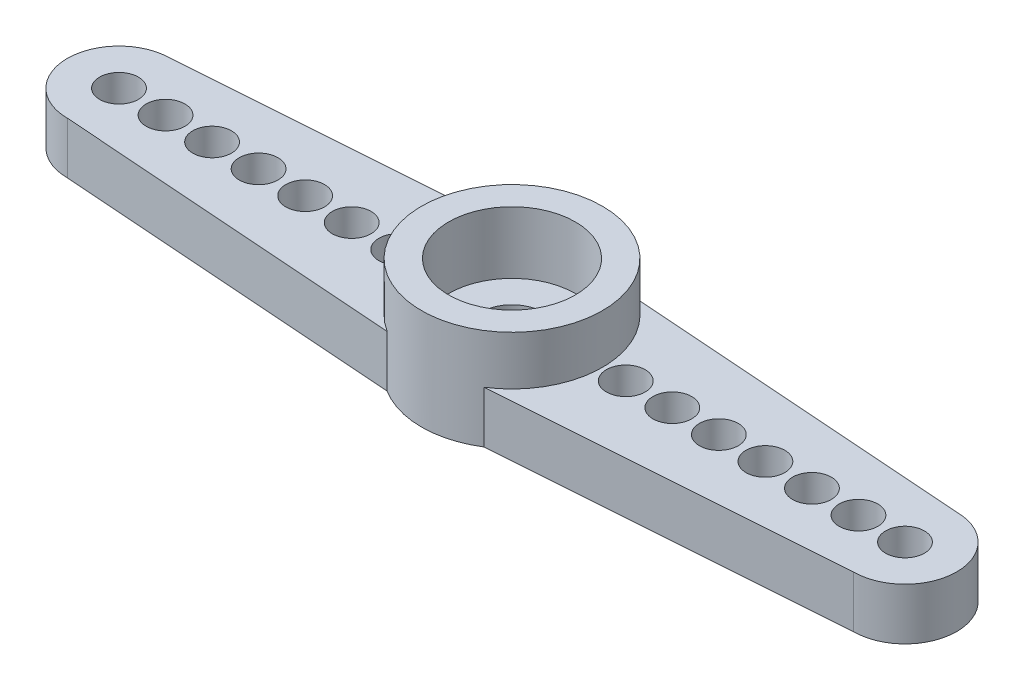
ISO-10303-21;
HEADER;
FILE_DESCRIPTION(('STEP AP214'),'2;1');
FILE_NAME('part.step','',(''),(''),'','','');
FILE_SCHEMA(('AUTOMOTIVE_DESIGN { 1 0 10303 214 1 1 1 1 }'));
ENDSEC;
DATA;
#1=APPLICATION_CONTEXT('core data for automotive mechanical design processes');
#2=APPLICATION_PROTOCOL_DEFINITION('international standard','automotive_design',2000,#1);
#3=PRODUCT_CONTEXT('',#1,'mechanical');
#4=PRODUCT('Part','Part','',(#3));
#5=PRODUCT_RELATED_PRODUCT_CATEGORY('part','',(#4));
#6=PRODUCT_DEFINITION_FORMATION('','',#4);
#7=PRODUCT_DEFINITION_CONTEXT('part definition',#1,'design');
#8=PRODUCT_DEFINITION('design','',#6,#7);
#9=PRODUCT_DEFINITION_SHAPE('','',#8);
#10=(LENGTH_UNIT() NAMED_UNIT(*) SI_UNIT(.MILLI.,.METRE.));
#11=(NAMED_UNIT(*) PLANE_ANGLE_UNIT() SI_UNIT($,.RADIAN.));
#12=(NAMED_UNIT(*) SI_UNIT($,.STERADIAN.) SOLID_ANGLE_UNIT());
#13=UNCERTAINTY_MEASURE_WITH_UNIT(LENGTH_MEASURE(1.E-05),#10,'distance_accuracy_value','');
#14=(GEOMETRIC_REPRESENTATION_CONTEXT(3) GLOBAL_UNCERTAINTY_ASSIGNED_CONTEXT((#13)) GLOBAL_UNIT_ASSIGNED_CONTEXT((#10,
#11,#12)) REPRESENTATION_CONTEXT('',''));
#15=CARTESIAN_POINT('',(0.,0.,0.));
#16=DIRECTION('',(0.,0.,1.));
#17=DIRECTION('',(1.,0.,0.));
#18=AXIS2_PLACEMENT_3D('',#15,#16,#17);
#19=CARTESIAN_POINT('',(0.,3.9,0.));
#20=DIRECTION('',(0.,-1.,0.));
#21=DIRECTION('',(0.,0.,-1.));
#22=AXIS2_PLACEMENT_3D('',#19,#20,#21);
#23=CYLINDRICAL_SURFACE('',#22,3.5);
#24=DIRECTION('',(0.,-1.,0.));
#25=VECTOR('',#24,1.);
#26=CARTESIAN_POINT('',(1.86858471289894,2.,2.95945791838985));
#27=LINE('',#26,#25);
#28=CARTESIAN_POINT('',(1.86858471289894,2.,2.95945791838985));
#29=VERTEX_POINT('',#28);
#30=CARTESIAN_POINT('',(1.86858471289894,0.,2.95945791838985));
#31=VERTEX_POINT('',#30);
#32=EDGE_CURVE('E125',#29,#31,#27,.T.);
#33=ORIENTED_EDGE('',*,*,#32,.F.);
#34=CARTESIAN_POINT('',(0.,2.,0.));
#35=DIRECTION('',(0.,1.,0.));
#36=DIRECTION('',(0.,0.,1.));
#37=AXIS2_PLACEMENT_3D('',#34,#35,#36);
#38=CIRCLE('',#37,3.5);
#39=CARTESIAN_POINT('',(1.86858471289895,2.,-2.95945791838985));
#40=VERTEX_POINT('',#39);
#41=EDGE_CURVE('E117',#29,#40,#38,.T.);
#42=ORIENTED_EDGE('',*,*,#41,.T.);
#43=DIRECTION('',(0.,-1.,0.));
#44=VECTOR('',#43,1.);
#45=CARTESIAN_POINT('',(1.86858471289895,2.,-2.95945791838985));
#46=LINE('',#45,#44);
#47=CARTESIAN_POINT('',(1.86858471289895,0.,-2.95945791838985));
#48=VERTEX_POINT('',#47);
#49=EDGE_CURVE('E101',#40,#48,#46,.T.);
#50=ORIENTED_EDGE('',*,*,#49,.T.);
#51=CARTESIAN_POINT('',(0.,0.,0.));
#52=DIRECTION('',(0.,-1.,0.));
#53=DIRECTION('',(0.,0.,-1.));
#54=AXIS2_PLACEMENT_3D('',#51,#52,#53);
#55=CIRCLE('',#54,3.5);
#56=CARTESIAN_POINT('',(-1.86858471289894,0.,-2.95945791838985));
#57=VERTEX_POINT('',#56);
#58=EDGE_CURVE('E41',#57,#48,#55,.T.);
#59=ORIENTED_EDGE('',*,*,#58,.F.);
#60=DIRECTION('',(0.,-1.,0.));
#61=VECTOR('',#60,1.);
#62=CARTESIAN_POINT('',(-1.86858471289895,2.,-2.95945791838985));
#63=LINE('',#62,#61);
#64=CARTESIAN_POINT('',(-1.86858471289895,2.,-2.95945791838985));
#65=VERTEX_POINT('',#64);
#66=EDGE_CURVE('E160',#65,#57,#63,.T.);
#67=ORIENTED_EDGE('',*,*,#66,.F.);
#68=CARTESIAN_POINT('',(0.,2.,0.));
#69=DIRECTION('',(0.,1.,0.));
#70=DIRECTION('',(0.,0.,1.));
#71=AXIS2_PLACEMENT_3D('',#68,#69,#70);
#72=CIRCLE('',#71,3.5);
#73=CARTESIAN_POINT('',(-1.86858471289894,2.,2.95945791838985));
#74=VERTEX_POINT('',#73);
#75=EDGE_CURVE('E142',#65,#74,#72,.T.);
#76=ORIENTED_EDGE('',*,*,#75,.T.);
#77=DIRECTION('',(0.,-1.,0.));
#78=VECTOR('',#77,1.);
#79=CARTESIAN_POINT('',(-1.86858471289894,2.,2.95945791838985));
#80=LINE('',#79,#78);
#81=CARTESIAN_POINT('',(-1.86858471289894,0.,2.95945791838985));
#82=VERTEX_POINT('',#81);
#83=EDGE_CURVE('E154',#74,#82,#80,.T.);
#84=ORIENTED_EDGE('',*,*,#83,.T.);
#85=EDGE_CURVE('E162',#31,#82,#55,.T.);
#86=ORIENTED_EDGE('',*,*,#85,.F.);
#87=EDGE_LOOP('',(#33,#42,#50,#59,#67,#76,#84,#86));
#88=FACE_BOUND('',#87,.T.);
#89=CARTESIAN_POINT('',(0.,3.9,0.));
#90=DIRECTION('',(0.,-1.,0.));
#91=DIRECTION('',(0.,0.,-1.));
#92=AXIS2_PLACEMENT_3D('',#89,#90,#91);
#93=CIRCLE('',#92,3.5);
#94=CARTESIAN_POINT('',(0.,3.9,-3.5));
#95=VERTEX_POINT('',#94);
#96=EDGE_CURVE('E11',#95,#95,#93,.T.);
#97=ORIENTED_EDGE('',*,*,#96,.T.);
#98=EDGE_LOOP('',(#97));
#99=FACE_BOUND('',#98,.T.);
#100=ADVANCED_FACE('F33',(#88,#99),#23,.T.);
#101=CARTESIAN_POINT('',(3.5,3.9,0.));
#102=DIRECTION('',(0.,1.,0.));
#103=DIRECTION('',(0.,0.,1.));
#104=AXIS2_PLACEMENT_3D('',#101,#102,#103);
#105=PLANE('',#104);
#106=CARTESIAN_POINT('',(0.,3.9,0.));
#107=DIRECTION('',(0.,-1.,0.));
#108=DIRECTION('',(0.,0.,-1.));
#109=AXIS2_PLACEMENT_3D('',#106,#107,#108);
#110=CIRCLE('',#109,2.45);
#111=CARTESIAN_POINT('',(0.,3.9,-2.45));
#112=VERTEX_POINT('',#111);
#113=EDGE_CURVE('E130',#112,#112,#110,.T.);
#114=ORIENTED_EDGE('',*,*,#113,.T.);
#115=EDGE_LOOP('',(#114));
#116=FACE_BOUND('',#115,.T.);
#117=ORIENTED_EDGE('',*,*,#96,.F.);
#118=EDGE_LOOP('',(#117));
#119=FACE_BOUND('',#118,.T.);
#120=ADVANCED_FACE('F250',(#116,#119),#105,.T.);
#121=CARTESIAN_POINT('',(0.,0.,0.));
#122=DIRECTION('',(0.,-1.,0.));
#123=DIRECTION('',(0.,0.,-1.));
#124=AXIS2_PLACEMENT_3D('',#121,#122,#123);
#125=PLANE('',#124);
#126=CARTESIAN_POINT('',(-15.2,0.,0.));
#127=DIRECTION('',(0.,-1.,0.));
#128=DIRECTION('',(0.,0.,-1.));
#129=AXIS2_PLACEMENT_3D('',#126,#127,#128);
#130=CIRCLE('',#129,0.749999999999999);
#131=CARTESIAN_POINT('',(-15.2,0.,-0.749999999999999));
#132=VERTEX_POINT('',#131);
#133=EDGE_CURVE('E414',#132,#132,#130,.T.);
#134=ORIENTED_EDGE('',*,*,#133,.F.);
#135=EDGE_LOOP('',(#134));
#136=FACE_BOUND('',#135,.T.);
#137=CARTESIAN_POINT('',(15.2,0.,0.));
#138=DIRECTION('',(0.,-1.,0.));
#139=DIRECTION('',(0.,0.,-1.));
#140=AXIS2_PLACEMENT_3D('',#137,#138,#139);
#141=CIRCLE('',#140,0.749999999999999);
#142=CARTESIAN_POINT('',(15.2,0.,-0.750000000000006));
#143=VERTEX_POINT('',#142);
#144=EDGE_CURVE('E416',#143,#143,#141,.T.);
#145=ORIENTED_EDGE('',*,*,#144,.F.);
#146=EDGE_LOOP('',(#145));
#147=FACE_BOUND('',#146,.T.);
#148=CARTESIAN_POINT('',(-13.4,0.,0.));
#149=DIRECTION('',(0.,-1.,0.));
#150=DIRECTION('',(0.,0.,-1.));
#151=AXIS2_PLACEMENT_3D('',#148,#149,#150);
#152=CIRCLE('',#151,0.749999999999999);
#153=CARTESIAN_POINT('',(-13.4,0.,-0.749999999999999));
#154=VERTEX_POINT('',#153);
#155=EDGE_CURVE('E421',#154,#154,#152,.T.);
#156=ORIENTED_EDGE('',*,*,#155,.F.);
#157=EDGE_LOOP('',(#156));
#158=FACE_BOUND('',#157,.T.);
#159=CARTESIAN_POINT('',(-11.6,0.,0.));
#160=DIRECTION('',(0.,-1.,0.));
#161=DIRECTION('',(0.,0.,-1.));
#162=AXIS2_PLACEMENT_3D('',#159,#160,#161);
#163=CIRCLE('',#162,0.749999999999999);
#164=CARTESIAN_POINT('',(-11.6,0.,-0.749999999999999));
#165=VERTEX_POINT('',#164);
#166=EDGE_CURVE('E427',#165,#165,#163,.T.);
#167=ORIENTED_EDGE('',*,*,#166,.F.);
#168=EDGE_LOOP('',(#167));
#169=FACE_BOUND('',#168,.T.);
#170=CARTESIAN_POINT('',(-9.8,0.,0.));
#171=DIRECTION('',(0.,-1.,0.));
#172=DIRECTION('',(0.,0.,-1.));
#173=AXIS2_PLACEMENT_3D('',#170,#171,#172);
#174=CIRCLE('',#173,0.749999999999999);
#175=CARTESIAN_POINT('',(-9.8,0.,-0.749999999999999));
#176=VERTEX_POINT('',#175);
#177=EDGE_CURVE('E197',#176,#176,#174,.T.);
#178=ORIENTED_EDGE('',*,*,#177,.F.);
#179=EDGE_LOOP('',(#178));
#180=FACE_BOUND('',#179,.T.);
#181=CARTESIAN_POINT('',(-8.,0.,0.));
#182=DIRECTION('',(0.,-1.,0.));
#183=DIRECTION('',(0.,0.,-1.));
#184=AXIS2_PLACEMENT_3D('',#181,#182,#183);
#185=CIRCLE('',#184,0.75);
#186=CARTESIAN_POINT('',(-8.,0.,-0.75));
#187=VERTEX_POINT('',#186);
#188=EDGE_CURVE('E185',#187,#187,#185,.T.);
#189=ORIENTED_EDGE('',*,*,#188,.F.);
#190=EDGE_LOOP('',(#189));
#191=FACE_BOUND('',#190,.T.);
#192=CARTESIAN_POINT('',(-6.2,0.,0.));
#193=DIRECTION('',(0.,-1.,0.));
#194=DIRECTION('',(0.,0.,-1.));
#195=AXIS2_PLACEMENT_3D('',#192,#193,#194);
#196=CIRCLE('',#195,0.75);
#197=CARTESIAN_POINT('',(-6.2,0.,-0.75));
#198=VERTEX_POINT('',#197);
#199=EDGE_CURVE('E184',#198,#198,#196,.T.);
#200=ORIENTED_EDGE('',*,*,#199,.F.);
#201=EDGE_LOOP('',(#200));
#202=FACE_BOUND('',#201,.T.);
#203=CARTESIAN_POINT('',(-4.4,0.,0.));
#204=DIRECTION('',(0.,-1.,0.));
#205=DIRECTION('',(0.,0.,-1.));
#206=AXIS2_PLACEMENT_3D('',#203,#204,#205);
#207=CIRCLE('',#206,0.75);
#208=CARTESIAN_POINT('',(-4.4,0.,-0.75));
#209=VERTEX_POINT('',#208);
#210=EDGE_CURVE('E181',#209,#209,#207,.T.);
#211=ORIENTED_EDGE('',*,*,#210,.F.);
#212=EDGE_LOOP('',(#211));
#213=FACE_BOUND('',#212,.T.);
#214=CARTESIAN_POINT('',(13.4,0.,0.));
#215=DIRECTION('',(0.,-1.,0.));
#216=DIRECTION('',(0.,0.,-1.));
#217=AXIS2_PLACEMENT_3D('',#214,#215,#216);
#218=CIRCLE('',#217,0.749999999999999);
#219=CARTESIAN_POINT('',(13.4,0.,-0.749999999999993));
#220=VERTEX_POINT('',#219);
#221=EDGE_CURVE('E178',#220,#220,#218,.T.);
#222=ORIENTED_EDGE('',*,*,#221,.F.);
#223=EDGE_LOOP('',(#222));
#224=FACE_BOUND('',#223,.T.);
#225=CARTESIAN_POINT('',(11.6,0.,0.));
#226=DIRECTION('',(0.,-1.,0.));
#227=DIRECTION('',(0.,0.,-1.));
#228=AXIS2_PLACEMENT_3D('',#225,#226,#227);
#229=CIRCLE('',#228,0.749999999999999);
#230=CARTESIAN_POINT('',(11.6,0.,-0.749999999999981));
#231=VERTEX_POINT('',#230);
#232=EDGE_CURVE('E174',#231,#231,#229,.T.);
#233=ORIENTED_EDGE('',*,*,#232,.F.);
#234=EDGE_LOOP('',(#233));
#235=FACE_BOUND('',#234,.T.);
#236=CARTESIAN_POINT('',(9.8,0.,0.));
#237=DIRECTION('',(0.,-1.,0.));
#238=DIRECTION('',(0.,0.,-1.));
#239=AXIS2_PLACEMENT_3D('',#236,#237,#238);
#240=CIRCLE('',#239,0.749999999999999);
#241=CARTESIAN_POINT('',(9.8,0.,-0.749999999999968));
#242=VERTEX_POINT('',#241);
#243=EDGE_CURVE('E173',#242,#242,#240,.T.);
#244=ORIENTED_EDGE('',*,*,#243,.F.);
#245=EDGE_LOOP('',(#244));
#246=FACE_BOUND('',#245,.T.);
#247=CARTESIAN_POINT('',(8.,0.,0.));
#248=DIRECTION('',(0.,-1.,0.));
#249=DIRECTION('',(0.,0.,-1.));
#250=AXIS2_PLACEMENT_3D('',#247,#248,#249);
#251=CIRCLE('',#250,0.749999999999999);
#252=CARTESIAN_POINT('',(8.,0.,-0.749999999999956));
#253=VERTEX_POINT('',#252);
#254=EDGE_CURVE('E214',#253,#253,#251,.T.);
#255=ORIENTED_EDGE('',*,*,#254,.F.);
#256=EDGE_LOOP('',(#255));
#257=FACE_BOUND('',#256,.T.);
#258=CARTESIAN_POINT('',(6.2,0.,0.));
#259=DIRECTION('',(0.,-1.,0.));
#260=DIRECTION('',(0.,0.,-1.));
#261=AXIS2_PLACEMENT_3D('',#258,#259,#260);
#262=CIRCLE('',#261,0.75);
#263=CARTESIAN_POINT('',(6.2,0.,-0.749999999999944));
#264=VERTEX_POINT('',#263);
#265=EDGE_CURVE('E220',#264,#264,#262,.T.);
#266=ORIENTED_EDGE('',*,*,#265,.F.);
#267=EDGE_LOOP('',(#266));
#268=FACE_BOUND('',#267,.T.);
#269=CARTESIAN_POINT('',(4.4,0.,0.));
#270=DIRECTION('',(0.,-1.,0.));
#271=DIRECTION('',(0.,0.,-1.));
#272=AXIS2_PLACEMENT_3D('',#269,#270,#271);
#273=CIRCLE('',#272,0.75);
#274=CARTESIAN_POINT('',(4.4,0.,-0.749999999999931));
#275=VERTEX_POINT('',#274);
#276=EDGE_CURVE('E226',#275,#275,#273,.T.);
#277=ORIENTED_EDGE('',*,*,#276,.F.);
#278=EDGE_LOOP('',(#277));
#279=FACE_BOUND('',#278,.T.);
#280=CARTESIAN_POINT('',(0.,0.,0.));
#281=DIRECTION('',(0.,-1.,0.));
#282=DIRECTION('',(0.,0.,-1.));
#283=AXIS2_PLACEMENT_3D('',#280,#281,#282);
#284=CIRCLE('',#283,2.35);
#285=CARTESIAN_POINT('',(0.,0.,-2.35));
#286=VERTEX_POINT('',#285);
#287=EDGE_CURVE('E243',#286,#286,#284,.T.);
#288=ORIENTED_EDGE('',*,*,#287,.F.);
#289=EDGE_LOOP('',(#288));
#290=FACE_BOUND('',#289,.T.);
#291=ORIENTED_EDGE('',*,*,#58,.T.);
#292=DIRECTION('',(0.997420198870011,0.,0.0717840294641297));
#293=VECTOR('',#292,1.);
#294=CARTESIAN_POINT('',(1.86858471289895,0.,-2.95945791838985));
#295=LINE('',#294,#293);
#296=CARTESIAN_POINT('',(15.2,0.,-2.00000000000001));
#297=VERTEX_POINT('',#296);
#298=EDGE_CURVE('E106',#48,#297,#295,.T.);
#299=ORIENTED_EDGE('',*,*,#298,.T.);
#300=CARTESIAN_POINT('',(15.2,0.,0.));
#301=DIRECTION('',(0.,-1.,0.));
#302=DIRECTION('',(0.,0.,-1.));
#303=AXIS2_PLACEMENT_3D('',#300,#301,#302);
#304=CIRCLE('',#303,2.);
#305=CARTESIAN_POINT('',(15.2,0.,2.));
#306=VERTEX_POINT('',#305);
#307=EDGE_CURVE('E127',#297,#306,#304,.T.);
#308=ORIENTED_EDGE('',*,*,#307,.T.);
#309=DIRECTION('',(-0.997420198870011,0.,0.0717840294641297));
#310=VECTOR('',#309,1.);
#311=CARTESIAN_POINT('',(15.2,0.,2.));
#312=LINE('',#311,#310);
#313=EDGE_CURVE('E49',#306,#31,#312,.T.);
#314=ORIENTED_EDGE('',*,*,#313,.T.);
#315=ORIENTED_EDGE('',*,*,#85,.T.);
#316=DIRECTION('',(-0.997420198870011,0.,-0.0717840294641297));
#317=VECTOR('',#316,1.);
#318=CARTESIAN_POINT('',(-1.86858471289894,0.,2.95945791838985));
#319=LINE('',#318,#317);
#320=CARTESIAN_POINT('',(-15.2,0.,2.));
#321=VERTEX_POINT('',#320);
#322=EDGE_CURVE('E138',#82,#321,#319,.T.);
#323=ORIENTED_EDGE('',*,*,#322,.T.);
#324=CARTESIAN_POINT('',(-15.2,0.,0.));
#325=DIRECTION('',(0.,-1.,0.));
#326=DIRECTION('',(0.,0.,-1.));
#327=AXIS2_PLACEMENT_3D('',#324,#325,#326);
#328=CIRCLE('',#327,2.);
#329=CARTESIAN_POINT('',(-15.2,0.,-2.));
#330=VERTEX_POINT('',#329);
#331=EDGE_CURVE('E157',#321,#330,#328,.T.);
#332=ORIENTED_EDGE('',*,*,#331,.T.);
#333=DIRECTION('',(0.997420198870011,0.,-0.0717840294641297));
#334=VECTOR('',#333,1.);
#335=CARTESIAN_POINT('',(-15.2,0.,-2.));
#336=LINE('',#335,#334);
#337=EDGE_CURVE('E56',#330,#57,#336,.T.);
#338=ORIENTED_EDGE('',*,*,#337,.T.);
#339=EDGE_LOOP('',(#291,#299,#308,#314,#315,#323,#332,#338));
#340=FACE_BOUND('',#339,.T.);
#341=ADVANCED_FACE('F287',(#136,#147,#158,#169,#180,#191,#202,#213,#224,#235,#246,#257,#268,
#279,#290,#340),#125,.T.);
#342=CARTESIAN_POINT('',(-15.2,2.,-2.));
#343=DIRECTION('',(-0.0717840294641297,0.,-0.997420198870011));
#344=DIRECTION('',(-0.997420198870011,0.,0.0717840294641297));
#345=AXIS2_PLACEMENT_3D('',#342,#343,#344);
#346=PLANE('',#345);
#347=ORIENTED_EDGE('',*,*,#337,.F.);
#348=DIRECTION('',(0.,-1.,0.));
#349=VECTOR('',#348,1.);
#350=CARTESIAN_POINT('',(-15.2,2.,-2.));
#351=LINE('',#350,#349);
#352=CARTESIAN_POINT('',(-15.2,2.,-2.));
#353=VERTEX_POINT('',#352);
#354=EDGE_CURVE('E163',#353,#330,#351,.T.);
#355=ORIENTED_EDGE('',*,*,#354,.F.);
#356=DIRECTION('',(0.997420198870011,0.,-0.0717840294641297));
#357=VECTOR('',#356,1.);
#358=CARTESIAN_POINT('',(-15.2,2.,-2.));
#359=LINE('',#358,#357);
#360=EDGE_CURVE('E151',#353,#65,#359,.T.);
#361=ORIENTED_EDGE('',*,*,#360,.T.);
#362=ORIENTED_EDGE('',*,*,#66,.T.);
#363=EDGE_LOOP('',(#347,#355,#361,#362));
#364=FACE_BOUND('',#363,.T.);
#365=ADVANCED_FACE('F291',(#364),#346,.T.);
#366=CARTESIAN_POINT('',(-15.2,2.,0.));
#367=DIRECTION('',(0.,-1.,0.));
#368=DIRECTION('',(0.,0.,-1.));
#369=AXIS2_PLACEMENT_3D('',#366,#367,#368);
#370=CYLINDRICAL_SURFACE('',#369,2.);
#371=ORIENTED_EDGE('',*,*,#331,.F.);
#372=DIRECTION('',(0.,-1.,0.));
#373=VECTOR('',#372,1.);
#374=CARTESIAN_POINT('',(-15.2,2.,2.));
#375=LINE('',#374,#373);
#376=CARTESIAN_POINT('',(-15.2,2.,2.));
#377=VERTEX_POINT('',#376);
#378=EDGE_CURVE('E165',#377,#321,#375,.T.);
#379=ORIENTED_EDGE('',*,*,#378,.F.);
#380=CARTESIAN_POINT('',(-15.2,2.,0.));
#381=DIRECTION('',(0.,-1.,0.));
#382=DIRECTION('',(0.,0.,-1.));
#383=AXIS2_PLACEMENT_3D('',#380,#381,#382);
#384=CIRCLE('',#383,2.);
#385=EDGE_CURVE('E148',#377,#353,#384,.T.);
#386=ORIENTED_EDGE('',*,*,#385,.T.);
#387=ORIENTED_EDGE('',*,*,#354,.T.);
#388=EDGE_LOOP('',(#371,#379,#386,#387));
#389=FACE_BOUND('',#388,.T.);
#390=ADVANCED_FACE('F299',(#389),#370,.T.);
#391=CARTESIAN_POINT('',(-1.86858471289894,2.,2.95945791838985));
#392=DIRECTION('',(-0.0717840294641297,0.,0.997420198870011));
#393=DIRECTION('',(0.997420198870011,0.,0.0717840294641297));
#394=AXIS2_PLACEMENT_3D('',#391,#392,#393);
#395=PLANE('',#394);
#396=ORIENTED_EDGE('',*,*,#322,.F.);
#397=ORIENTED_EDGE('',*,*,#83,.F.);
#398=DIRECTION('',(-0.997420198870011,0.,-0.0717840294641297));
#399=VECTOR('',#398,1.);
#400=CARTESIAN_POINT('',(-1.86858471289894,2.,2.95945791838985));
#401=LINE('',#400,#399);
#402=EDGE_CURVE('E145',#74,#377,#401,.T.);
#403=ORIENTED_EDGE('',*,*,#402,.T.);
#404=ORIENTED_EDGE('',*,*,#378,.T.);
#405=EDGE_LOOP('',(#396,#397,#403,#404));
#406=FACE_BOUND('',#405,.T.);
#407=ADVANCED_FACE('F295',(#406),#395,.T.);
#408=CARTESIAN_POINT('',(0.,2.,0.));
#409=DIRECTION('',(0.,1.,0.));
#410=DIRECTION('',(0.,0.,1.));
#411=AXIS2_PLACEMENT_3D('',#408,#409,#410);
#412=PLANE('',#411);
#413=CARTESIAN_POINT('',(-15.2,2.,0.));
#414=DIRECTION('',(0.,1.,0.));
#415=DIRECTION('',(0.,0.,1.));
#416=AXIS2_PLACEMENT_3D('',#413,#414,#415);
#417=CIRCLE('',#416,0.749999999999999);
#418=CARTESIAN_POINT('',(-15.2,2.,0.749999999999999));
#419=VERTEX_POINT('',#418);
#420=EDGE_CURVE('E36',#419,#419,#417,.T.);
#421=ORIENTED_EDGE('',*,*,#420,.F.);
#422=EDGE_LOOP('',(#421));
#423=FACE_BOUND('',#422,.T.);
#424=CARTESIAN_POINT('',(-13.4,2.,0.));
#425=DIRECTION('',(0.,1.,0.));
#426=DIRECTION('',(0.,0.,1.));
#427=AXIS2_PLACEMENT_3D('',#424,#425,#426);
#428=CIRCLE('',#427,0.749999999999999);
#429=CARTESIAN_POINT('',(-13.4,2.,0.749999999999999));
#430=VERTEX_POINT('',#429);
#431=EDGE_CURVE('E424',#430,#430,#428,.T.);
#432=ORIENTED_EDGE('',*,*,#431,.F.);
#433=EDGE_LOOP('',(#432));
#434=FACE_BOUND('',#433,.T.);
#435=CARTESIAN_POINT('',(-11.6,2.,0.));
#436=DIRECTION('',(0.,1.,0.));
#437=DIRECTION('',(0.,0.,1.));
#438=AXIS2_PLACEMENT_3D('',#435,#436,#437);
#439=CIRCLE('',#438,0.749999999999999);
#440=CARTESIAN_POINT('',(-11.6,2.,0.749999999999999));
#441=VERTEX_POINT('',#440);
#442=EDGE_CURVE('E430',#441,#441,#439,.T.);
#443=ORIENTED_EDGE('',*,*,#442,.F.);
#444=EDGE_LOOP('',(#443));
#445=FACE_BOUND('',#444,.T.);
#446=CARTESIAN_POINT('',(-9.8,2.,0.));
#447=DIRECTION('',(0.,1.,0.));
#448=DIRECTION('',(0.,0.,1.));
#449=AXIS2_PLACEMENT_3D('',#446,#447,#448);
#450=CIRCLE('',#449,0.749999999999999);
#451=CARTESIAN_POINT('',(-9.8,2.,0.749999999999999));
#452=VERTEX_POINT('',#451);
#453=EDGE_CURVE('E192',#452,#452,#450,.T.);
#454=ORIENTED_EDGE('',*,*,#453,.F.);
#455=EDGE_LOOP('',(#454));
#456=FACE_BOUND('',#455,.T.);
#457=CARTESIAN_POINT('',(-8.,2.,0.));
#458=DIRECTION('',(0.,1.,0.));
#459=DIRECTION('',(0.,0.,1.));
#460=AXIS2_PLACEMENT_3D('',#457,#458,#459);
#461=CIRCLE('',#460,0.749999999999999);
#462=CARTESIAN_POINT('',(-8.,2.,0.749999999999999));
#463=VERTEX_POINT('',#462);
#464=EDGE_CURVE('E182',#463,#463,#461,.T.);
#465=ORIENTED_EDGE('',*,*,#464,.F.);
#466=EDGE_LOOP('',(#465));
#467=FACE_BOUND('',#466,.T.);
#468=CARTESIAN_POINT('',(-6.2,2.,0.));
#469=DIRECTION('',(0.,1.,0.));
#470=DIRECTION('',(0.,0.,1.));
#471=AXIS2_PLACEMENT_3D('',#468,#469,#470);
#472=CIRCLE('',#471,0.749999999999999);
#473=CARTESIAN_POINT('',(-6.2,2.,0.749999999999999));
#474=VERTEX_POINT('',#473);
#475=EDGE_CURVE('E189',#474,#474,#472,.T.);
#476=ORIENTED_EDGE('',*,*,#475,.F.);
#477=EDGE_LOOP('',(#476));
#478=FACE_BOUND('',#477,.T.);
#479=CARTESIAN_POINT('',(-4.4,2.,0.));
#480=DIRECTION('',(0.,1.,0.));
#481=DIRECTION('',(0.,0.,1.));
#482=AXIS2_PLACEMENT_3D('',#479,#480,#481);
#483=CIRCLE('',#482,0.749999999999999);
#484=CARTESIAN_POINT('',(-4.4,2.,0.749999999999999));
#485=VERTEX_POINT('',#484);
#486=EDGE_CURVE('E179',#485,#485,#483,.T.);
#487=ORIENTED_EDGE('',*,*,#486,.F.);
#488=EDGE_LOOP('',(#487));
#489=FACE_BOUND('',#488,.T.);
#490=ORIENTED_EDGE('',*,*,#75,.F.);
#491=ORIENTED_EDGE('',*,*,#360,.F.);
#492=ORIENTED_EDGE('',*,*,#385,.F.);
#493=ORIENTED_EDGE('',*,*,#402,.F.);
#494=EDGE_LOOP('',(#490,#491,#492,#493));
#495=FACE_BOUND('',#494,.T.);
#496=ADVANCED_FACE('F298',(#423,#434,#445,#456,#467,#478,#489,#495),#412,.T.);
#497=CARTESIAN_POINT('',(15.2,2.,2.));
#498=DIRECTION('',(0.0717840294641297,0.,0.997420198870011));
#499=DIRECTION('',(0.997420198870011,0.,-0.0717840294641297));
#500=AXIS2_PLACEMENT_3D('',#497,#498,#499);
#501=PLANE('',#500);
#502=ORIENTED_EDGE('',*,*,#313,.F.);
#503=DIRECTION('',(0.,-1.,0.));
#504=VECTOR('',#503,1.);
#505=CARTESIAN_POINT('',(15.2,2.,2.));
#506=LINE('',#505,#504);
#507=CARTESIAN_POINT('',(15.2,2.,2.));
#508=VERTEX_POINT('',#507);
#509=EDGE_CURVE('E139',#508,#306,#506,.T.);
#510=ORIENTED_EDGE('',*,*,#509,.F.);
#511=DIRECTION('',(-0.997420198870011,0.,0.0717840294641297));
#512=VECTOR('',#511,1.);
#513=CARTESIAN_POINT('',(15.2,2.,2.));
#514=LINE('',#513,#512);
#515=EDGE_CURVE('E111',#508,#29,#514,.T.);
#516=ORIENTED_EDGE('',*,*,#515,.T.);
#517=ORIENTED_EDGE('',*,*,#32,.T.);
#518=EDGE_LOOP('',(#502,#510,#516,#517));
#519=FACE_BOUND('',#518,.T.);
#520=ADVANCED_FACE('F309',(#519),#501,.T.);
#521=CARTESIAN_POINT('',(15.2,2.,0.));
#522=DIRECTION('',(0.,-1.,0.));
#523=DIRECTION('',(0.,0.,-1.));
#524=AXIS2_PLACEMENT_3D('',#521,#522,#523);
#525=CYLINDRICAL_SURFACE('',#524,2.);
#526=ORIENTED_EDGE('',*,*,#307,.F.);
#527=DIRECTION('',(0.,-1.,0.));
#528=VECTOR('',#527,1.);
#529=CARTESIAN_POINT('',(15.2,2.,-2.00000000000001));
#530=LINE('',#529,#528);
#531=CARTESIAN_POINT('',(15.2,2.,-2.00000000000001));
#532=VERTEX_POINT('',#531);
#533=EDGE_CURVE('E110',#532,#297,#530,.T.);
#534=ORIENTED_EDGE('',*,*,#533,.F.);
#535=CARTESIAN_POINT('',(15.2,2.,0.));
#536=DIRECTION('',(0.,-1.,0.));
#537=DIRECTION('',(0.,0.,-1.));
#538=AXIS2_PLACEMENT_3D('',#535,#536,#537);
#539=CIRCLE('',#538,2.);
#540=EDGE_CURVE('E120',#532,#508,#539,.T.);
#541=ORIENTED_EDGE('',*,*,#540,.T.);
#542=ORIENTED_EDGE('',*,*,#509,.T.);
#543=EDGE_LOOP('',(#526,#534,#541,#542));
#544=FACE_BOUND('',#543,.T.);
#545=ADVANCED_FACE('F313',(#544),#525,.T.);
#546=CARTESIAN_POINT('',(1.86858471289895,2.,-2.95945791838985));
#547=DIRECTION('',(0.0717840294641297,0.,-0.997420198870011));
#548=DIRECTION('',(-0.997420198870011,0.,-0.0717840294641297));
#549=AXIS2_PLACEMENT_3D('',#546,#547,#548);
#550=PLANE('',#549);
#551=ORIENTED_EDGE('',*,*,#298,.F.);
#552=ORIENTED_EDGE('',*,*,#49,.F.);
#553=DIRECTION('',(0.997420198870011,0.,0.0717840294641297));
#554=VECTOR('',#553,1.);
#555=CARTESIAN_POINT('',(1.86858471289895,2.,-2.95945791838985));
#556=LINE('',#555,#554);
#557=EDGE_CURVE('E104',#40,#532,#556,.T.);
#558=ORIENTED_EDGE('',*,*,#557,.T.);
#559=ORIENTED_EDGE('',*,*,#533,.T.);
#560=EDGE_LOOP('',(#551,#552,#558,#559));
#561=FACE_BOUND('',#560,.T.);
#562=ADVANCED_FACE('F103',(#561),#550,.T.);
#563=CARTESIAN_POINT('',(0.,2.,0.));
#564=DIRECTION('',(0.,1.,0.));
#565=DIRECTION('',(0.,0.,1.));
#566=AXIS2_PLACEMENT_3D('',#563,#564,#565);
#567=PLANE('',#566);
#568=CARTESIAN_POINT('',(15.2,2.,0.));
#569=DIRECTION('',(0.,1.,0.));
#570=DIRECTION('',(0.,0.,1.));
#571=AXIS2_PLACEMENT_3D('',#568,#569,#570);
#572=CIRCLE('',#571,0.749999999999999);
#573=CARTESIAN_POINT('',(15.2,2.,0.749999999999992));
#574=VERTEX_POINT('',#573);
#575=EDGE_CURVE('E327',#574,#574,#572,.T.);
#576=ORIENTED_EDGE('',*,*,#575,.F.);
#577=EDGE_LOOP('',(#576));
#578=FACE_BOUND('',#577,.T.);
#579=CARTESIAN_POINT('',(13.4,2.,0.));
#580=DIRECTION('',(0.,1.,0.));
#581=DIRECTION('',(0.,0.,1.));
#582=AXIS2_PLACEMENT_3D('',#579,#580,#581);
#583=CIRCLE('',#582,0.749999999999999);
#584=CARTESIAN_POINT('',(13.4,2.,0.750000000000005));
#585=VERTEX_POINT('',#584);
#586=EDGE_CURVE('E175',#585,#585,#583,.T.);
#587=ORIENTED_EDGE('',*,*,#586,.F.);
#588=EDGE_LOOP('',(#587));
#589=FACE_BOUND('',#588,.T.);
#590=CARTESIAN_POINT('',(11.6,2.,0.));
#591=DIRECTION('',(0.,1.,0.));
#592=DIRECTION('',(0.,0.,1.));
#593=AXIS2_PLACEMENT_3D('',#590,#591,#592);
#594=CIRCLE('',#593,0.749999999999999);
#595=CARTESIAN_POINT('',(11.6,2.,0.750000000000017));
#596=VERTEX_POINT('',#595);
#597=EDGE_CURVE('E170',#596,#596,#594,.T.);
#598=ORIENTED_EDGE('',*,*,#597,.F.);
#599=EDGE_LOOP('',(#598));
#600=FACE_BOUND('',#599,.T.);
#601=CARTESIAN_POINT('',(9.8,2.,0.));
#602=DIRECTION('',(0.,1.,0.));
#603=DIRECTION('',(0.,0.,1.));
#604=AXIS2_PLACEMENT_3D('',#601,#602,#603);
#605=CIRCLE('',#604,0.749999999999999);
#606=CARTESIAN_POINT('',(9.8,2.,0.75000000000003));
#607=VERTEX_POINT('',#606);
#608=EDGE_CURVE('E211',#607,#607,#605,.T.);
#609=ORIENTED_EDGE('',*,*,#608,.F.);
#610=EDGE_LOOP('',(#609));
#611=FACE_BOUND('',#610,.T.);
#612=CARTESIAN_POINT('',(8.,2.,0.));
#613=DIRECTION('',(0.,1.,0.));
#614=DIRECTION('',(0.,0.,1.));
#615=AXIS2_PLACEMENT_3D('',#612,#613,#614);
#616=CIRCLE('',#615,0.749999999999999);
#617=CARTESIAN_POINT('',(8.,2.,0.750000000000042));
#618=VERTEX_POINT('',#617);
#619=EDGE_CURVE('E217',#618,#618,#616,.T.);
#620=ORIENTED_EDGE('',*,*,#619,.F.);
#621=EDGE_LOOP('',(#620));
#622=FACE_BOUND('',#621,.T.);
#623=CARTESIAN_POINT('',(6.2,2.,0.));
#624=DIRECTION('',(0.,1.,0.));
#625=DIRECTION('',(0.,0.,1.));
#626=AXIS2_PLACEMENT_3D('',#623,#624,#625);
#627=CIRCLE('',#626,0.749999999999999);
#628=CARTESIAN_POINT('',(6.2,2.,0.750000000000055));
#629=VERTEX_POINT('',#628);
#630=EDGE_CURVE('E223',#629,#629,#627,.T.);
#631=ORIENTED_EDGE('',*,*,#630,.F.);
#632=EDGE_LOOP('',(#631));
#633=FACE_BOUND('',#632,.T.);
#634=CARTESIAN_POINT('',(4.4,2.,0.));
#635=DIRECTION('',(0.,1.,0.));
#636=DIRECTION('',(0.,0.,1.));
#637=AXIS2_PLACEMENT_3D('',#634,#635,#636);
#638=CIRCLE('',#637,0.749999999999999);
#639=CARTESIAN_POINT('',(4.4,2.,0.750000000000068));
#640=VERTEX_POINT('',#639);
#641=EDGE_CURVE('E229',#640,#640,#638,.T.);
#642=ORIENTED_EDGE('',*,*,#641,.F.);
#643=EDGE_LOOP('',(#642));
#644=FACE_BOUND('',#643,.T.);
#645=ORIENTED_EDGE('',*,*,#41,.F.);
#646=ORIENTED_EDGE('',*,*,#515,.F.);
#647=ORIENTED_EDGE('',*,*,#540,.F.);
#648=ORIENTED_EDGE('',*,*,#557,.F.);
#649=EDGE_LOOP('',(#645,#646,#647,#648));
#650=FACE_BOUND('',#649,.T.);
#651=ADVANCED_FACE('F115',(#578,#589,#600,#611,#622,#633,#644,#650),#567,.T.);
#652=CARTESIAN_POINT('',(0.,3.9,0.));
#653=DIRECTION('',(0.,-1.,0.));
#654=DIRECTION('',(0.,0.,-1.));
#655=AXIS2_PLACEMENT_3D('',#652,#653,#654);
#656=CYLINDRICAL_SURFACE('',#655,2.45);
#657=ORIENTED_EDGE('',*,*,#113,.F.);
#658=EDGE_LOOP('',(#657));
#659=FACE_BOUND('',#658,.T.);
#660=CARTESIAN_POINT('',(0.,1.5,0.));
#661=DIRECTION('',(0.,-1.,0.));
#662=DIRECTION('',(0.,0.,-1.));
#663=AXIS2_PLACEMENT_3D('',#660,#661,#662);
#664=CIRCLE('',#663,2.45);
#665=CARTESIAN_POINT('',(0.,1.5,-2.45));
#666=VERTEX_POINT('',#665);
#667=EDGE_CURVE('E232',#666,#666,#664,.T.);
#668=ORIENTED_EDGE('',*,*,#667,.T.);
#669=EDGE_LOOP('',(#668));
#670=FACE_BOUND('',#669,.T.);
#671=ADVANCED_FACE('F253',(#659,#670),#656,.F.);
#672=CARTESIAN_POINT('',(0.,3.9,0.));
#673=DIRECTION('',(0.,-1.,0.));
#674=DIRECTION('',(0.,0.,-1.));
#675=AXIS2_PLACEMENT_3D('',#672,#673,#674);
#676=CYLINDRICAL_SURFACE('',#675,2.35);
#677=CARTESIAN_POINT('',(0.,1.,0.));
#678=DIRECTION('',(0.,-1.,0.));
#679=DIRECTION('',(0.,0.,-1.));
#680=AXIS2_PLACEMENT_3D('',#677,#678,#679);
#681=CIRCLE('',#680,2.35);
#682=CARTESIAN_POINT('',(0.,1.,-2.35));
#683=VERTEX_POINT('',#682);
#684=EDGE_CURVE('E241',#683,#683,#681,.T.);
#685=ORIENTED_EDGE('',*,*,#684,.F.);
#686=EDGE_LOOP('',(#685));
#687=FACE_BOUND('',#686,.T.);
#688=ORIENTED_EDGE('',*,*,#287,.T.);
#689=EDGE_LOOP('',(#688));
#690=FACE_BOUND('',#689,.T.);
#691=ADVANCED_FACE('F256',(#687,#690),#676,.F.);
#692=CARTESIAN_POINT('',(2.35,1.,0.));
#693=DIRECTION('',(0.,1.,0.));
#694=DIRECTION('',(0.,0.,1.));
#695=AXIS2_PLACEMENT_3D('',#692,#693,#694);
#696=PLANE('',#695);
#697=CARTESIAN_POINT('',(0.,1.,0.));
#698=DIRECTION('',(0.,-1.,0.));
#699=DIRECTION('',(0.,0.,-1.));
#700=AXIS2_PLACEMENT_3D('',#697,#698,#699);
#701=CIRCLE('',#700,1.2);
#702=CARTESIAN_POINT('',(0.,1.,-1.2));
#703=VERTEX_POINT('',#702);
#704=EDGE_CURVE('E238',#703,#703,#701,.T.);
#705=ORIENTED_EDGE('',*,*,#704,.F.);
#706=EDGE_LOOP('',(#705));
#707=FACE_BOUND('',#706,.T.);
#708=ORIENTED_EDGE('',*,*,#684,.T.);
#709=EDGE_LOOP('',(#708));
#710=FACE_BOUND('',#709,.T.);
#711=ADVANCED_FACE('F270',(#707,#710),#696,.F.);
#712=CARTESIAN_POINT('',(0.,3.9,0.));
#713=DIRECTION('',(0.,-1.,0.));
#714=DIRECTION('',(0.,0.,-1.));
#715=AXIS2_PLACEMENT_3D('',#712,#713,#714);
#716=CYLINDRICAL_SURFACE('',#715,1.2);
#717=CARTESIAN_POINT('',(0.,1.5,0.));
#718=DIRECTION('',(0.,-1.,0.));
#719=DIRECTION('',(0.,0.,-1.));
#720=AXIS2_PLACEMENT_3D('',#717,#718,#719);
#721=CIRCLE('',#720,1.2);
#722=CARTESIAN_POINT('',(0.,1.5,-1.2));
#723=VERTEX_POINT('',#722);
#724=EDGE_CURVE('E235',#723,#723,#721,.T.);
#725=ORIENTED_EDGE('',*,*,#724,.F.);
#726=EDGE_LOOP('',(#725));
#727=FACE_BOUND('',#726,.T.);
#728=ORIENTED_EDGE('',*,*,#704,.T.);
#729=EDGE_LOOP('',(#728));
#730=FACE_BOUND('',#729,.T.);
#731=ADVANCED_FACE('F264',(#727,#730),#716,.F.);
#732=CARTESIAN_POINT('',(1.2,1.5,0.));
#733=DIRECTION('',(0.,-1.,0.));
#734=DIRECTION('',(0.,0.,-1.));
#735=AXIS2_PLACEMENT_3D('',#732,#733,#734);
#736=PLANE('',#735);
#737=ORIENTED_EDGE('',*,*,#667,.F.);
#738=EDGE_LOOP('',(#737));
#739=FACE_BOUND('',#738,.T.);
#740=ORIENTED_EDGE('',*,*,#724,.T.);
#741=EDGE_LOOP('',(#740));
#742=FACE_BOUND('',#741,.T.);
#743=ADVANCED_FACE('F260',(#739,#742),#736,.F.);
#744=CARTESIAN_POINT('',(4.4,0.,0.));
#745=DIRECTION('',(0.,-1.,0.));
#746=DIRECTION('',(0.,0.,-1.));
#747=AXIS2_PLACEMENT_3D('',#744,#745,#746);
#748=CYLINDRICAL_SURFACE('',#747,0.749999999999999);
#749=ORIENTED_EDGE('',*,*,#641,.T.);
#750=EDGE_LOOP('',(#749));
#751=FACE_BOUND('',#750,.T.);
#752=ORIENTED_EDGE('',*,*,#276,.T.);
#753=EDGE_LOOP('',(#752));
#754=FACE_BOUND('',#753,.T.);
#755=ADVANCED_FACE('F263',(#751,#754),#748,.F.);
#756=CARTESIAN_POINT('',(6.2,0.,0.));
#757=DIRECTION('',(0.,-1.,0.));
#758=DIRECTION('',(0.,0.,-1.));
#759=AXIS2_PLACEMENT_3D('',#756,#757,#758);
#760=CYLINDRICAL_SURFACE('',#759,0.749999999999999);
#761=ORIENTED_EDGE('',*,*,#630,.T.);
#762=EDGE_LOOP('',(#761));
#763=FACE_BOUND('',#762,.T.);
#764=ORIENTED_EDGE('',*,*,#265,.T.);
#765=EDGE_LOOP('',(#764));
#766=FACE_BOUND('',#765,.T.);
#767=ADVANCED_FACE('F342',(#763,#766),#760,.F.);
#768=CARTESIAN_POINT('',(8.,0.,0.));
#769=DIRECTION('',(0.,-1.,0.));
#770=DIRECTION('',(0.,0.,-1.));
#771=AXIS2_PLACEMENT_3D('',#768,#769,#770);
#772=CYLINDRICAL_SURFACE('',#771,0.749999999999999);
#773=ORIENTED_EDGE('',*,*,#619,.T.);
#774=EDGE_LOOP('',(#773));
#775=FACE_BOUND('',#774,.T.);
#776=ORIENTED_EDGE('',*,*,#254,.T.);
#777=EDGE_LOOP('',(#776));
#778=FACE_BOUND('',#777,.T.);
#779=ADVANCED_FACE('F358',(#775,#778),#772,.F.);
#780=CARTESIAN_POINT('',(9.8,0.,0.));
#781=DIRECTION('',(0.,-1.,0.));
#782=DIRECTION('',(0.,0.,-1.));
#783=AXIS2_PLACEMENT_3D('',#780,#781,#782);
#784=CYLINDRICAL_SURFACE('',#783,0.749999999999999);
#785=ORIENTED_EDGE('',*,*,#608,.T.);
#786=EDGE_LOOP('',(#785));
#787=FACE_BOUND('',#786,.T.);
#788=ORIENTED_EDGE('',*,*,#243,.T.);
#789=EDGE_LOOP('',(#788));
#790=FACE_BOUND('',#789,.T.);
#791=ADVANCED_FACE('F364',(#787,#790),#784,.F.);
#792=CARTESIAN_POINT('',(11.6,0.,0.));
#793=DIRECTION('',(0.,-1.,0.));
#794=DIRECTION('',(0.,0.,-1.));
#795=AXIS2_PLACEMENT_3D('',#792,#793,#794);
#796=CYLINDRICAL_SURFACE('',#795,0.749999999999999);
#797=ORIENTED_EDGE('',*,*,#597,.T.);
#798=EDGE_LOOP('',(#797));
#799=FACE_BOUND('',#798,.T.);
#800=ORIENTED_EDGE('',*,*,#232,.T.);
#801=EDGE_LOOP('',(#800));
#802=FACE_BOUND('',#801,.T.);
#803=ADVANCED_FACE('F368',(#799,#802),#796,.F.);
#804=CARTESIAN_POINT('',(13.4,0.,0.));
#805=DIRECTION('',(0.,-1.,0.));
#806=DIRECTION('',(0.,0.,-1.));
#807=AXIS2_PLACEMENT_3D('',#804,#805,#806);
#808=CYLINDRICAL_SURFACE('',#807,0.749999999999999);
#809=ORIENTED_EDGE('',*,*,#586,.T.);
#810=EDGE_LOOP('',(#809));
#811=FACE_BOUND('',#810,.T.);
#812=ORIENTED_EDGE('',*,*,#221,.T.);
#813=EDGE_LOOP('',(#812));
#814=FACE_BOUND('',#813,.T.);
#815=ADVANCED_FACE('F372',(#811,#814),#808,.F.);
#816=CARTESIAN_POINT('',(-4.4,0.,0.));
#817=DIRECTION('',(0.,-1.,0.));
#818=DIRECTION('',(0.,0.,-1.));
#819=AXIS2_PLACEMENT_3D('',#816,#817,#818);
#820=CYLINDRICAL_SURFACE('',#819,0.749999999999999);
#821=ORIENTED_EDGE('',*,*,#486,.T.);
#822=EDGE_LOOP('',(#821));
#823=FACE_BOUND('',#822,.T.);
#824=ORIENTED_EDGE('',*,*,#210,.T.);
#825=EDGE_LOOP('',(#824));
#826=FACE_BOUND('',#825,.T.);
#827=ADVANCED_FACE('F376',(#823,#826),#820,.F.);
#828=CARTESIAN_POINT('',(-6.2,0.,0.));
#829=DIRECTION('',(0.,-1.,0.));
#830=DIRECTION('',(0.,0.,-1.));
#831=AXIS2_PLACEMENT_3D('',#828,#829,#830);
#832=CYLINDRICAL_SURFACE('',#831,0.749999999999999);
#833=ORIENTED_EDGE('',*,*,#475,.T.);
#834=EDGE_LOOP('',(#833));
#835=FACE_BOUND('',#834,.T.);
#836=ORIENTED_EDGE('',*,*,#199,.T.);
#837=EDGE_LOOP('',(#836));
#838=FACE_BOUND('',#837,.T.);
#839=ADVANCED_FACE('F380',(#835,#838),#832,.F.);
#840=CARTESIAN_POINT('',(-8.,0.,0.));
#841=DIRECTION('',(0.,-1.,0.));
#842=DIRECTION('',(0.,0.,-1.));
#843=AXIS2_PLACEMENT_3D('',#840,#841,#842);
#844=CYLINDRICAL_SURFACE('',#843,0.749999999999999);
#845=ORIENTED_EDGE('',*,*,#464,.T.);
#846=EDGE_LOOP('',(#845));
#847=FACE_BOUND('',#846,.T.);
#848=ORIENTED_EDGE('',*,*,#188,.T.);
#849=EDGE_LOOP('',(#848));
#850=FACE_BOUND('',#849,.T.);
#851=ADVANCED_FACE('F384',(#847,#850),#844,.F.);
#852=CARTESIAN_POINT('',(-9.8,0.,0.));
#853=DIRECTION('',(0.,-1.,0.));
#854=DIRECTION('',(0.,0.,-1.));
#855=AXIS2_PLACEMENT_3D('',#852,#853,#854);
#856=CYLINDRICAL_SURFACE('',#855,0.749999999999999);
#857=ORIENTED_EDGE('',*,*,#453,.T.);
#858=EDGE_LOOP('',(#857));
#859=FACE_BOUND('',#858,.T.);
#860=ORIENTED_EDGE('',*,*,#177,.T.);
#861=EDGE_LOOP('',(#860));
#862=FACE_BOUND('',#861,.T.);
#863=ADVANCED_FACE('F388',(#859,#862),#856,.F.);
#864=CARTESIAN_POINT('',(-11.6,0.,0.));
#865=DIRECTION('',(0.,-1.,0.));
#866=DIRECTION('',(0.,0.,-1.));
#867=AXIS2_PLACEMENT_3D('',#864,#865,#866);
#868=CYLINDRICAL_SURFACE('',#867,0.749999999999999);
#869=ORIENTED_EDGE('',*,*,#442,.T.);
#870=EDGE_LOOP('',(#869));
#871=FACE_BOUND('',#870,.T.);
#872=ORIENTED_EDGE('',*,*,#166,.T.);
#873=EDGE_LOOP('',(#872));
#874=FACE_BOUND('',#873,.T.);
#875=ADVANCED_FACE('F391',(#871,#874),#868,.F.);
#876=CARTESIAN_POINT('',(-13.4,0.,0.));
#877=DIRECTION('',(0.,-1.,0.));
#878=DIRECTION('',(0.,0.,-1.));
#879=AXIS2_PLACEMENT_3D('',#876,#877,#878);
#880=CYLINDRICAL_SURFACE('',#879,0.749999999999999);
#881=ORIENTED_EDGE('',*,*,#431,.T.);
#882=EDGE_LOOP('',(#881));
#883=FACE_BOUND('',#882,.T.);
#884=ORIENTED_EDGE('',*,*,#155,.T.);
#885=EDGE_LOOP('',(#884));
#886=FACE_BOUND('',#885,.T.);
#887=ADVANCED_FACE('F395',(#883,#886),#880,.F.);
#888=CARTESIAN_POINT('',(15.2,0.,0.));
#889=DIRECTION('',(0.,-1.,0.));
#890=DIRECTION('',(0.,0.,-1.));
#891=AXIS2_PLACEMENT_3D('',#888,#889,#890);
#892=CYLINDRICAL_SURFACE('',#891,0.749999999999999);
#893=ORIENTED_EDGE('',*,*,#575,.T.);
#894=EDGE_LOOP('',(#893));
#895=FACE_BOUND('',#894,.T.);
#896=ORIENTED_EDGE('',*,*,#144,.T.);
#897=EDGE_LOOP('',(#896));
#898=FACE_BOUND('',#897,.T.);
#899=ADVANCED_FACE('F399',(#895,#898),#892,.F.);
#900=CARTESIAN_POINT('',(-15.2,0.,0.));
#901=DIRECTION('',(0.,-1.,0.));
#902=DIRECTION('',(0.,0.,-1.));
#903=AXIS2_PLACEMENT_3D('',#900,#901,#902);
#904=CYLINDRICAL_SURFACE('',#903,0.749999999999999);
#905=ORIENTED_EDGE('',*,*,#420,.T.);
#906=EDGE_LOOP('',(#905));
#907=FACE_BOUND('',#906,.T.);
#908=ORIENTED_EDGE('',*,*,#133,.T.);
#909=EDGE_LOOP('',(#908));
#910=FACE_BOUND('',#909,.T.);
#911=ADVANCED_FACE('F403',(#907,#910),#904,.F.);
#912=CLOSED_SHELL('',(#100,#120,#341,#365,#390,#407,#496,#520,#545,#562,#651,#671,#691,#711,
#731,#743,#755,#767,#779,#791,#803,#815,#827,#839,#851,#863,#875,#887,#899,#911));
#913=MANIFOLD_SOLID_BREP('B2',#912);
#914=ADVANCED_BREP_SHAPE_REPRESENTATION('',(#18,#913),#14);
#915=SHAPE_DEFINITION_REPRESENTATION(#9,#914);
ENDSEC;
END-ISO-10303-21;
